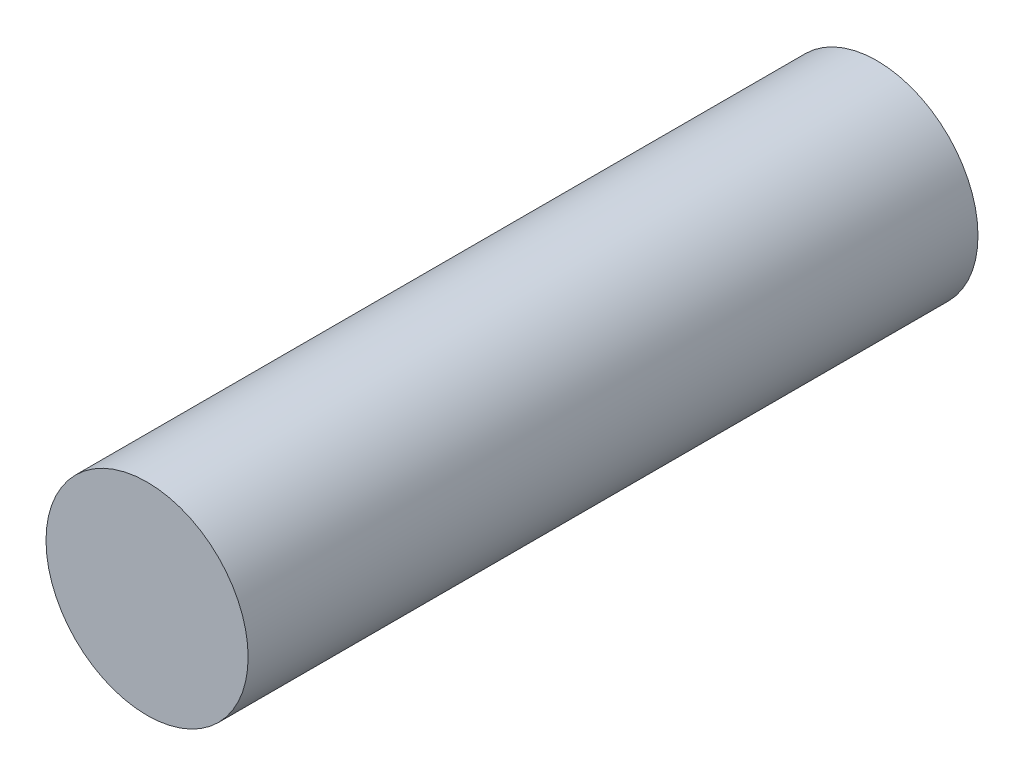
ISO-10303-21;
HEADER;
FILE_DESCRIPTION(('STEP AP214'),'2;1');
FILE_NAME('part.step','',(''),(''),'','','');
FILE_SCHEMA(('AUTOMOTIVE_DESIGN { 1 0 10303 214 1 1 1 1 }'));
ENDSEC;
DATA;
#1=APPLICATION_CONTEXT('core data for automotive mechanical design processes');
#2=APPLICATION_PROTOCOL_DEFINITION('international standard','automotive_design',2000,#1);
#3=PRODUCT_CONTEXT('',#1,'mechanical');
#4=PRODUCT('Part','Part','',(#3));
#5=PRODUCT_RELATED_PRODUCT_CATEGORY('part','',(#4));
#6=PRODUCT_DEFINITION_FORMATION('','',#4);
#7=PRODUCT_DEFINITION_CONTEXT('part definition',#1,'design');
#8=PRODUCT_DEFINITION('design','',#6,#7);
#9=PRODUCT_DEFINITION_SHAPE('','',#8);
#10=(LENGTH_UNIT() NAMED_UNIT(*) SI_UNIT(.MILLI.,.METRE.));
#11=(NAMED_UNIT(*) PLANE_ANGLE_UNIT() SI_UNIT($,.RADIAN.));
#12=(NAMED_UNIT(*) SI_UNIT($,.STERADIAN.) SOLID_ANGLE_UNIT());
#13=UNCERTAINTY_MEASURE_WITH_UNIT(LENGTH_MEASURE(1.E-05),#10,'distance_accuracy_value','');
#14=(GEOMETRIC_REPRESENTATION_CONTEXT(3) GLOBAL_UNCERTAINTY_ASSIGNED_CONTEXT((#13)) GLOBAL_UNIT_ASSIGNED_CONTEXT((#10,
#11,#12)) REPRESENTATION_CONTEXT('',''));
#15=CARTESIAN_POINT('',(0.,0.,0.));
#16=DIRECTION('',(0.,0.,1.));
#17=DIRECTION('',(1.,0.,0.));
#18=AXIS2_PLACEMENT_3D('',#15,#16,#17);
#19=CARTESIAN_POINT('',(-43.2267180763811,0.,65.));
#20=DIRECTION('',(0.,0.,-1.));
#21=DIRECTION('',(-1.,0.,0.));
#22=AXIS2_PLACEMENT_3D('',#19,#20,#21);
#23=CYLINDRICAL_SURFACE('',#22,9.);
#24=CARTESIAN_POINT('',(-43.2267180763811,0.,65.));
#25=DIRECTION('',(0.,0.,1.));
#26=DIRECTION('',(1.,0.,0.));
#27=AXIS2_PLACEMENT_3D('',#24,#25,#26);
#28=CIRCLE('',#27,9.);
#29=CARTESIAN_POINT('',(-34.2267180763811,0.,65.));
#30=VERTEX_POINT('',#29);
#31=EDGE_CURVE('E10',#30,#30,#28,.T.);
#32=ORIENTED_EDGE('',*,*,#31,.F.);
#33=EDGE_LOOP('',(#32));
#34=FACE_BOUND('',#33,.T.);
#35=CARTESIAN_POINT('',(-43.2267180763811,0.,0.));
#36=DIRECTION('',(0.,0.,1.));
#37=DIRECTION('',(1.,0.,0.));
#38=AXIS2_PLACEMENT_3D('',#35,#36,#37);
#39=CIRCLE('',#38,9.);
#40=CARTESIAN_POINT('',(-34.2267180763811,0.,0.));
#41=VERTEX_POINT('',#40);
#42=EDGE_CURVE('E41',#41,#41,#39,.T.);
#43=ORIENTED_EDGE('',*,*,#42,.T.);
#44=EDGE_LOOP('',(#43));
#45=FACE_BOUND('',#44,.T.);
#46=ADVANCED_FACE('F38',(#34,#45),#23,.T.);
#47=CARTESIAN_POINT('',(-43.2267180763811,0.,65.));
#48=DIRECTION('',(0.,0.,1.));
#49=DIRECTION('',(1.,0.,0.));
#50=AXIS2_PLACEMENT_3D('',#47,#48,#49);
#51=PLANE('',#50);
#52=ORIENTED_EDGE('',*,*,#31,.T.);
#53=EDGE_LOOP('',(#52));
#54=FACE_BOUND('',#53,.T.);
#55=ADVANCED_FACE('F68',(#54),#51,.T.);
#56=CARTESIAN_POINT('',(-43.2267180763811,0.,0.));
#57=DIRECTION('',(0.,0.,1.));
#58=DIRECTION('',(1.,0.,0.));
#59=AXIS2_PLACEMENT_3D('',#56,#57,#58);
#60=PLANE('',#59);
#61=CARTESIAN_POINT('',(-43.2267180763811,0.,0.));
#62=DIRECTION('',(0.,0.,1.));
#63=DIRECTION('',(1.,0.,0.));
#64=AXIS2_PLACEMENT_3D('',#61,#62,#63);
#65=CIRCLE('',#64,3.);
#66=CARTESIAN_POINT('',(-40.2267180763811,0.,0.));
#67=VERTEX_POINT('',#66);
#68=EDGE_CURVE('E50',#67,#67,#65,.T.);
#69=ORIENTED_EDGE('',*,*,#68,.T.);
#70=EDGE_LOOP('',(#69));
#71=FACE_BOUND('',#70,.T.);
#72=ORIENTED_EDGE('',*,*,#42,.F.);
#73=EDGE_LOOP('',(#72));
#74=FACE_BOUND('',#73,.T.);
#75=ADVANCED_FACE('F65',(#71,#74),#60,.F.);
#76=CARTESIAN_POINT('',(-43.2267180763811,0.,-1.5));
#77=DIRECTION('',(0.,0.,1.));
#78=DIRECTION('',(1.,0.,0.));
#79=AXIS2_PLACEMENT_3D('',#76,#77,#78);
#80=CYLINDRICAL_SURFACE('',#79,3.);
#81=CARTESIAN_POINT('',(-43.2267180763811,0.,-1.5));
#82=DIRECTION('',(0.,0.,1.));
#83=DIRECTION('',(1.,0.,0.));
#84=AXIS2_PLACEMENT_3D('',#81,#82,#83);
#85=CIRCLE('',#84,3.);
#86=CARTESIAN_POINT('',(-40.2267180763811,0.,-1.5));
#87=VERTEX_POINT('',#86);
#88=EDGE_CURVE('E48',#87,#87,#85,.T.);
#89=ORIENTED_EDGE('',*,*,#88,.T.);
#90=EDGE_LOOP('',(#89));
#91=FACE_BOUND('',#90,.T.);
#92=ORIENTED_EDGE('',*,*,#68,.F.);
#93=EDGE_LOOP('',(#92));
#94=FACE_BOUND('',#93,.T.);
#95=ADVANCED_FACE('F56',(#91,#94),#80,.T.);
#96=CARTESIAN_POINT('',(-43.2267180763811,0.,-1.5));
#97=DIRECTION('',(0.,0.,1.));
#98=DIRECTION('',(1.,0.,0.));
#99=AXIS2_PLACEMENT_3D('',#96,#97,#98);
#100=PLANE('',#99);
#101=ORIENTED_EDGE('',*,*,#88,.F.);
#102=EDGE_LOOP('',(#101));
#103=FACE_BOUND('',#102,.T.);
#104=ADVANCED_FACE('F59',(#103),#100,.F.);
#105=CLOSED_SHELL('',(#46,#55,#75,#95,#104));
#106=MANIFOLD_SOLID_BREP('B2',#105);
#107=ADVANCED_BREP_SHAPE_REPRESENTATION('',(#18,#106),#14);
#108=SHAPE_DEFINITION_REPRESENTATION(#9,#107);
ENDSEC;
END-ISO-10303-21;
